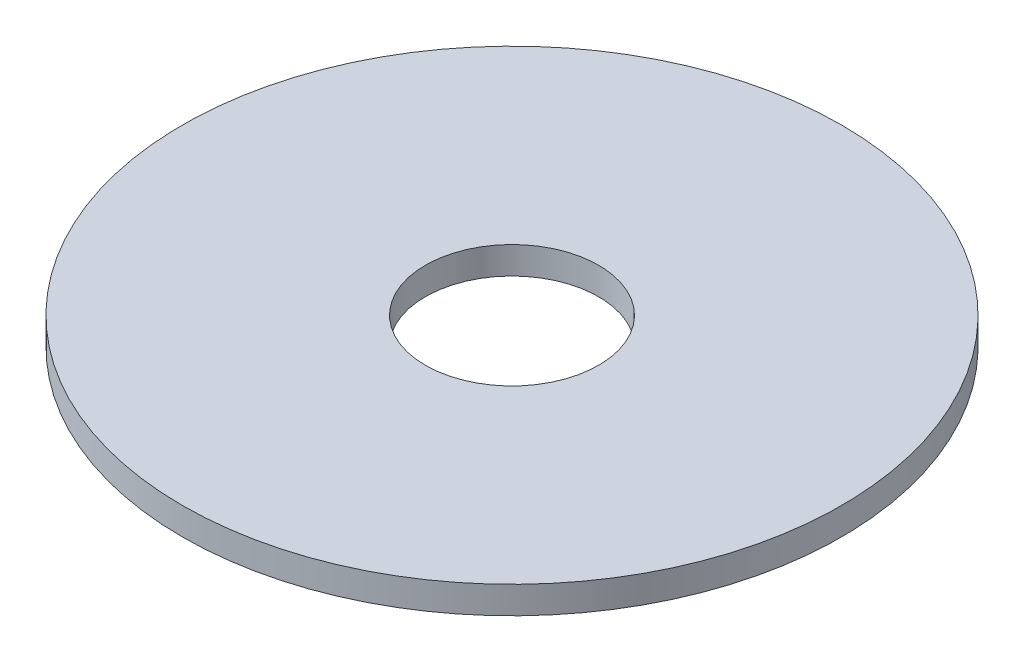
ISO-10303-21;
HEADER;
FILE_DESCRIPTION(('STEP AP214'),'2;1');
FILE_NAME('part.step','',(''),(''),'','','');
FILE_SCHEMA(('AUTOMOTIVE_DESIGN { 1 0 10303 214 1 1 1 1 }'));
ENDSEC;
DATA;
#1=APPLICATION_CONTEXT('core data for automotive mechanical design processes');
#2=APPLICATION_PROTOCOL_DEFINITION('international standard','automotive_design',2000,#1);
#3=PRODUCT_CONTEXT('',#1,'mechanical');
#4=PRODUCT('Part','Part','',(#3));
#5=PRODUCT_RELATED_PRODUCT_CATEGORY('part','',(#4));
#6=PRODUCT_DEFINITION_FORMATION('','',#4);
#7=PRODUCT_DEFINITION_CONTEXT('part definition',#1,'design');
#8=PRODUCT_DEFINITION('design','',#6,#7);
#9=PRODUCT_DEFINITION_SHAPE('','',#8);
#10=(LENGTH_UNIT() NAMED_UNIT(*) SI_UNIT(.MILLI.,.METRE.));
#11=(NAMED_UNIT(*) PLANE_ANGLE_UNIT() SI_UNIT($,.RADIAN.));
#12=(NAMED_UNIT(*) SI_UNIT($,.STERADIAN.) SOLID_ANGLE_UNIT());
#13=UNCERTAINTY_MEASURE_WITH_UNIT(LENGTH_MEASURE(1.E-05),#10,'distance_accuracy_value','');
#14=(GEOMETRIC_REPRESENTATION_CONTEXT(3) GLOBAL_UNCERTAINTY_ASSIGNED_CONTEXT((#13)) GLOBAL_UNIT_ASSIGNED_CONTEXT((#10,
#11,#12)) REPRESENTATION_CONTEXT('',''));
#15=CARTESIAN_POINT('',(0.,0.,0.));
#16=DIRECTION('',(0.,0.,1.));
#17=DIRECTION('',(1.,0.,0.));
#18=AXIS2_PLACEMENT_3D('',#15,#16,#17);
#19=CARTESIAN_POINT('',(0.,2.,0.));
#20=DIRECTION('',(0.,1.,0.));
#21=DIRECTION('',(0.,0.,1.));
#22=AXIS2_PLACEMENT_3D('',#19,#20,#21);
#23=PLANE('',#22);
#24=CARTESIAN_POINT('',(0.,2.,0.));
#25=DIRECTION('',(0.,1.,0.));
#26=DIRECTION('',(0.,0.,1.));
#27=AXIS2_PLACEMENT_3D('',#24,#25,#26);
#28=CIRCLE('',#27,24.15);
#29=CARTESIAN_POINT('',(0.,2.,24.15));
#30=VERTEX_POINT('',#29);
#31=EDGE_CURVE('E10',#30,#30,#28,.T.);
#32=ORIENTED_EDGE('',*,*,#31,.T.);
#33=EDGE_LOOP('',(#32));
#34=FACE_BOUND('',#33,.T.);
#35=CARTESIAN_POINT('',(0.,2.,0.));
#36=DIRECTION('',(0.,1.,0.));
#37=DIRECTION('',(0.,0.,1.));
#38=AXIS2_PLACEMENT_3D('',#35,#36,#37);
#39=CIRCLE('',#38,6.35);
#40=CARTESIAN_POINT('',(0.,2.,6.35));
#41=VERTEX_POINT('',#40);
#42=EDGE_CURVE('E50',#41,#41,#39,.T.);
#43=ORIENTED_EDGE('',*,*,#42,.F.);
#44=EDGE_LOOP('',(#43));
#45=FACE_BOUND('',#44,.T.);
#46=ADVANCED_FACE('F37',(#34,#45),#23,.T.);
#47=CARTESIAN_POINT('',(0.,0.,0.));
#48=DIRECTION('',(0.,1.,0.));
#49=DIRECTION('',(0.,0.,1.));
#50=AXIS2_PLACEMENT_3D('',#47,#48,#49);
#51=PLANE('',#50);
#52=CARTESIAN_POINT('',(0.,0.,0.));
#53=DIRECTION('',(0.,1.,0.));
#54=DIRECTION('',(0.,0.,1.));
#55=AXIS2_PLACEMENT_3D('',#52,#53,#54);
#56=CIRCLE('',#55,24.15);
#57=CARTESIAN_POINT('',(0.,0.,24.15));
#58=VERTEX_POINT('',#57);
#59=EDGE_CURVE('E41',#58,#58,#56,.T.);
#60=ORIENTED_EDGE('',*,*,#59,.F.);
#61=EDGE_LOOP('',(#60));
#62=FACE_BOUND('',#61,.T.);
#63=CARTESIAN_POINT('',(0.,0.,0.));
#64=DIRECTION('',(0.,1.,0.));
#65=DIRECTION('',(0.,0.,1.));
#66=AXIS2_PLACEMENT_3D('',#63,#64,#65);
#67=CIRCLE('',#66,6.35);
#68=CARTESIAN_POINT('',(0.,0.,6.35));
#69=VERTEX_POINT('',#68);
#70=EDGE_CURVE('E52',#69,#69,#67,.T.);
#71=ORIENTED_EDGE('',*,*,#70,.T.);
#72=EDGE_LOOP('',(#71));
#73=FACE_BOUND('',#72,.T.);
#74=ADVANCED_FACE('F64',(#62,#73),#51,.F.);
#75=CARTESIAN_POINT('',(0.,2.,0.));
#76=DIRECTION('',(0.,-1.,0.));
#77=DIRECTION('',(0.,0.,-1.));
#78=AXIS2_PLACEMENT_3D('',#75,#76,#77);
#79=CYLINDRICAL_SURFACE('',#78,24.15);
#80=ORIENTED_EDGE('',*,*,#31,.F.);
#81=EDGE_LOOP('',(#80));
#82=FACE_BOUND('',#81,.T.);
#83=ORIENTED_EDGE('',*,*,#59,.T.);
#84=EDGE_LOOP('',(#83));
#85=FACE_BOUND('',#84,.T.);
#86=ADVANCED_FACE('F39',(#82,#85),#79,.T.);
#87=CARTESIAN_POINT('',(0.,2.,0.));
#88=DIRECTION('',(0.,-1.,0.));
#89=DIRECTION('',(0.,0.,-1.));
#90=AXIS2_PLACEMENT_3D('',#87,#88,#89);
#91=CYLINDRICAL_SURFACE('',#90,6.35);
#92=ORIENTED_EDGE('',*,*,#42,.T.);
#93=EDGE_LOOP('',(#92));
#94=FACE_BOUND('',#93,.T.);
#95=ORIENTED_EDGE('',*,*,#70,.F.);
#96=EDGE_LOOP('',(#95));
#97=FACE_BOUND('',#96,.T.);
#98=ADVANCED_FACE('F60',(#94,#97),#91,.F.);
#99=CLOSED_SHELL('',(#46,#74,#86,#98));
#100=MANIFOLD_SOLID_BREP('B2',#99);
#101=ADVANCED_BREP_SHAPE_REPRESENTATION('',(#18,#100),#14);
#102=SHAPE_DEFINITION_REPRESENTATION(#9,#101);
ENDSEC;
END-ISO-10303-21;
